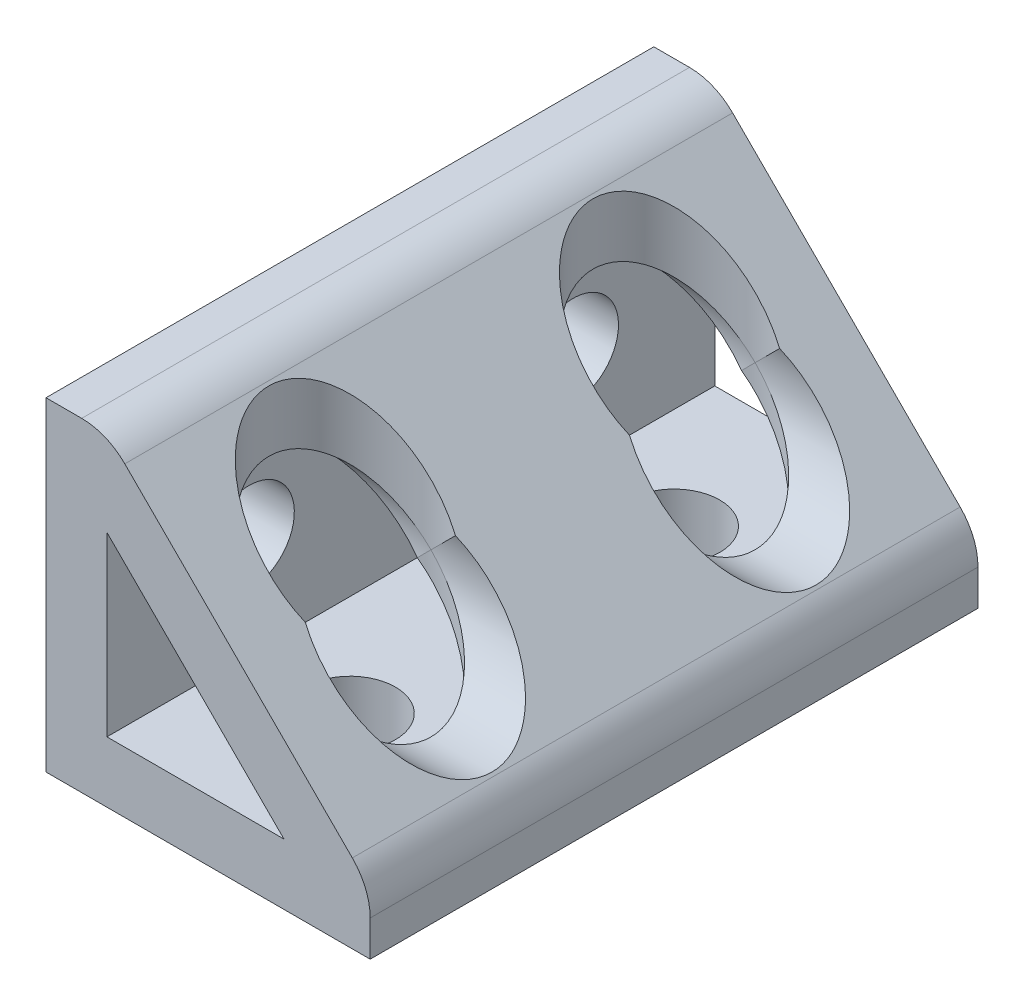
ISO-10303-21;
HEADER;
FILE_DESCRIPTION(('STEP AP214'),'2;1');
FILE_NAME('part.step','',(''),(''),'','','');
FILE_SCHEMA(('AUTOMOTIVE_DESIGN { 1 0 10303 214 1 1 1 1 }'));
ENDSEC;
DATA;
#1=APPLICATION_CONTEXT('core data for automotive mechanical design processes');
#2=APPLICATION_PROTOCOL_DEFINITION('international standard','automotive_design',2000,#1);
#3=PRODUCT_CONTEXT('',#1,'mechanical');
#4=PRODUCT('Part','Part','',(#3));
#5=PRODUCT_RELATED_PRODUCT_CATEGORY('part','',(#4));
#6=PRODUCT_DEFINITION_FORMATION('','',#4);
#7=PRODUCT_DEFINITION_CONTEXT('part definition',#1,'design');
#8=PRODUCT_DEFINITION('design','',#6,#7);
#9=PRODUCT_DEFINITION_SHAPE('','',#8);
#10=(LENGTH_UNIT() NAMED_UNIT(*) SI_UNIT(.MILLI.,.METRE.));
#11=(NAMED_UNIT(*) PLANE_ANGLE_UNIT() SI_UNIT($,.RADIAN.));
#12=(NAMED_UNIT(*) SI_UNIT($,.STERADIAN.) SOLID_ANGLE_UNIT());
#13=UNCERTAINTY_MEASURE_WITH_UNIT(LENGTH_MEASURE(1.E-05),#10,'distance_accuracy_value','');
#14=(GEOMETRIC_REPRESENTATION_CONTEXT(3) GLOBAL_UNCERTAINTY_ASSIGNED_CONTEXT((#13)) GLOBAL_UNIT_ASSIGNED_CONTEXT((#10,
#11,#12)) REPRESENTATION_CONTEXT('',''));
#15=CARTESIAN_POINT('',(0.,0.,0.));
#16=DIRECTION('',(0.,0.,1.));
#17=DIRECTION('',(1.,0.,0.));
#18=AXIS2_PLACEMENT_3D('',#15,#16,#17);
#19=CARTESIAN_POINT('',(12.7,0.,-12.7));
#20=DIRECTION('',(-1.,0.,0.));
#21=DIRECTION('',(0.,-1.,0.));
#22=AXIS2_PLACEMENT_3D('',#19,#20,#21);
#23=CYLINDRICAL_SURFACE('',#22,6.35);
#24=CARTESIAN_POINT('',(0.,0.,-12.7));
#25=DIRECTION('',(-0.707106781186547,-0.707106781186548,0.));
#26=DIRECTION('',(-0.707106781186548,0.707106781186547,0.));
#27=AXIS2_PLACEMENT_3D('',#24,#25,#26);
#28=ELLIPSE('',#27,8.98025612106916,6.35);
#29=CARTESIAN_POINT('',(0.,0.,-6.35));
#30=VERTEX_POINT('',#29);
#31=CARTESIAN_POINT('',(0.,0.,-19.05));
#32=VERTEX_POINT('',#31);
#33=EDGE_CURVE('E515',#30,#32,#28,.F.);
#34=ORIENTED_EDGE('',*,*,#33,.F.);
#35=CARTESIAN_POINT('',(0.,0.,-12.7));
#36=DIRECTION('',(-0.707106781186548,0.707106781186547,0.));
#37=DIRECTION('',(-0.707106781186547,-0.707106781186548,0.));
#38=AXIS2_PLACEMENT_3D('',#35,#36,#37);
#39=ELLIPSE('',#38,8.98025612106916,6.35);
#40=CARTESIAN_POINT('',(2.3876,2.3876,-6.81596513946424));
#41=VERTEX_POINT('',#40);
#42=EDGE_CURVE('E566',#41,#30,#39,.F.);
#43=ORIENTED_EDGE('',*,*,#42,.F.);
#44=CARTESIAN_POINT('',(4.7752,0.,-12.7));
#45=DIRECTION('',(0.707106781186547,0.707106781186548,0.));
#46=DIRECTION('',(-0.707106781186548,0.707106781186547,0.));
#47=AXIS2_PLACEMENT_3D('',#44,#45,#46);
#48=ELLIPSE('',#47,8.98025612106916,6.35);
#49=CARTESIAN_POINT('',(2.3876,2.3876,-18.5840348605358));
#50=VERTEX_POINT('',#49);
#51=EDGE_CURVE('E428',#50,#41,#48,.F.);
#52=ORIENTED_EDGE('',*,*,#51,.F.);
#53=EDGE_CURVE('E657',#32,#50,#39,.F.);
#54=ORIENTED_EDGE('',*,*,#53,.F.);
#55=EDGE_LOOP('',(#34,#43,#52,#54));
#56=FACE_BOUND('',#55,.T.);
#57=ADVANCED_FACE('F47',(#56),#23,.F.);
#58=CARTESIAN_POINT('',(12.7,0.,12.7));
#59=DIRECTION('',(-1.,0.,0.));
#60=DIRECTION('',(0.,-1.,0.));
#61=AXIS2_PLACEMENT_3D('',#58,#59,#60);
#62=CYLINDRICAL_SURFACE('',#61,6.35);
#63=CARTESIAN_POINT('',(0.,0.,12.7));
#64=DIRECTION('',(-0.707106781186547,-0.707106781186548,0.));
#65=DIRECTION('',(-0.707106781186548,0.707106781186547,0.));
#66=AXIS2_PLACEMENT_3D('',#63,#64,#65);
#67=ELLIPSE('',#66,8.98025612106916,6.35);
#68=CARTESIAN_POINT('',(0.,0.,19.05));
#69=VERTEX_POINT('',#68);
#70=CARTESIAN_POINT('',(0.,0.,6.35));
#71=VERTEX_POINT('',#70);
#72=EDGE_CURVE('E536',#69,#71,#67,.F.);
#73=ORIENTED_EDGE('',*,*,#72,.F.);
#74=CARTESIAN_POINT('',(0.,0.,12.7));
#75=DIRECTION('',(-0.707106781186548,0.707106781186547,0.));
#76=DIRECTION('',(-0.707106781186547,-0.707106781186548,0.));
#77=AXIS2_PLACEMENT_3D('',#74,#75,#76);
#78=ELLIPSE('',#77,8.98025612106916,6.35);
#79=CARTESIAN_POINT('',(2.3876,2.3876,18.5840348605358));
#80=VERTEX_POINT('',#79);
#81=EDGE_CURVE('E529',#80,#69,#78,.F.);
#82=ORIENTED_EDGE('',*,*,#81,.F.);
#83=CARTESIAN_POINT('',(4.7752,0.,12.7));
#84=DIRECTION('',(0.707106781186547,0.707106781186548,0.));
#85=DIRECTION('',(-0.707106781186548,0.707106781186547,0.));
#86=AXIS2_PLACEMENT_3D('',#83,#84,#85);
#87=ELLIPSE('',#86,8.98025612106916,6.35);
#88=CARTESIAN_POINT('',(2.3876,2.3876,6.81596513946424));
#89=VERTEX_POINT('',#88);
#90=EDGE_CURVE('E347',#89,#80,#87,.F.);
#91=ORIENTED_EDGE('',*,*,#90,.F.);
#92=EDGE_CURVE('E532',#71,#89,#78,.F.);
#93=ORIENTED_EDGE('',*,*,#92,.F.);
#94=EDGE_LOOP('',(#73,#82,#91,#93));
#95=FACE_BOUND('',#94,.T.);
#96=ADVANCED_FACE('F495',(#95),#62,.F.);
#97=CARTESIAN_POINT('',(5.94684739695598,-7.9248,-23.8125));
#98=DIRECTION('',(0.707106781186547,0.707106781186548,0.));
#99=DIRECTION('',(-0.707106781186548,0.707106781186547,0.));
#100=AXIS2_PLACEMENT_3D('',#97,#98,#99);
#101=PLANE('',#100);
#102=DIRECTION('',(0.,0.,1.));
#103=VECTOR('',#102,1.);
#104=CARTESIAN_POINT('',(5.94684739695598,-7.9248,-23.8125));
#105=LINE('',#104,#103);
#106=CARTESIAN_POINT('',(5.94684739695598,-7.9248,-10.4734542364196));
#107=VERTEX_POINT('',#106);
#108=CARTESIAN_POINT('',(5.94684739695598,-7.9248,10.4734542364196));
#109=VERTEX_POINT('',#108);
#110=EDGE_CURVE('E259',#107,#109,#105,.T.);
#111=ORIENTED_EDGE('',*,*,#110,.T.);
#112=CARTESIAN_POINT('',(0.,-1.97795260304402,12.7));
#113=DIRECTION('',(0.707106781186547,0.707106781186548,0.));
#114=DIRECTION('',(0.707106781186548,-0.707106781186547,0.));
#115=AXIS2_PLACEMENT_3D('',#112,#113,#114);
#116=ELLIPSE('',#115,8.98025612106916,6.35);
#117=CARTESIAN_POINT('',(-0.988976301522011,-0.988976301522013,6.42748647868912));
#118=VERTEX_POINT('',#117);
#119=EDGE_CURVE('E233',#109,#118,#116,.T.);
#120=ORIENTED_EDGE('',*,*,#119,.T.);
#121=CARTESIAN_POINT('',(-1.97795260304402,0.,12.7));
#122=DIRECTION('',(0.707106781186547,0.707106781186548,0.));
#123=DIRECTION('',(-0.707106781186548,0.707106781186547,0.));
#124=AXIS2_PLACEMENT_3D('',#121,#122,#123);
#125=ELLIPSE('',#124,8.98025612106916,6.35);
#126=CARTESIAN_POINT('',(-7.9248,5.94684739695598,10.4734542364196));
#127=VERTEX_POINT('',#126);
#128=EDGE_CURVE('E439',#127,#118,#125,.F.);
#129=ORIENTED_EDGE('',*,*,#128,.F.);
#130=DIRECTION('',(0.,0.,1.));
#131=VECTOR('',#130,1.);
#132=CARTESIAN_POINT('',(-7.9248,5.94684739695598,-23.8125));
#133=LINE('',#132,#131);
#134=CARTESIAN_POINT('',(-7.9248,5.94684739695598,-10.4734542364196));
#135=VERTEX_POINT('',#134);
#136=EDGE_CURVE('E403',#135,#127,#133,.T.);
#137=ORIENTED_EDGE('',*,*,#136,.F.);
#138=CARTESIAN_POINT('',(-1.97795260304402,0.,-12.7));
#139=DIRECTION('',(0.707106781186547,0.707106781186548,0.));
#140=DIRECTION('',(-0.707106781186548,0.707106781186547,0.));
#141=AXIS2_PLACEMENT_3D('',#138,#139,#140);
#142=ELLIPSE('',#141,8.98025612106916,6.35);
#143=CARTESIAN_POINT('',(-0.988976301522011,-0.988976301522013,-6.42748647868912));
#144=VERTEX_POINT('',#143);
#145=EDGE_CURVE('E429',#144,#135,#142,.F.);
#146=ORIENTED_EDGE('',*,*,#145,.F.);
#147=CARTESIAN_POINT('',(0.,-1.97795260304402,-12.7));
#148=DIRECTION('',(0.707106781186547,0.707106781186548,0.));
#149=DIRECTION('',(0.707106781186548,-0.707106781186547,0.));
#150=AXIS2_PLACEMENT_3D('',#147,#148,#149);
#151=ELLIPSE('',#150,8.98025612106916,6.35);
#152=EDGE_CURVE('E523',#144,#107,#151,.T.);
#153=ORIENTED_EDGE('',*,*,#152,.T.);
#154=EDGE_LOOP('',(#111,#120,#129,#137,#146,#153));
#155=FACE_BOUND('',#154,.T.);
#156=ADVANCED_FACE('F493',(#155),#101,.F.);
#157=CARTESIAN_POINT('',(5.94684739695598,-7.9248,-23.8125));
#158=VERTEX_POINT('',#157);
#159=CARTESIAN_POINT('',(5.94684739695598,-7.9248,-14.9265457635804));
#160=VERTEX_POINT('',#159);
#161=EDGE_CURVE('E262',#158,#160,#105,.T.);
#162=ORIENTED_EDGE('',*,*,#161,.T.);
#163=CARTESIAN_POINT('',(-0.988976301522011,-0.988976301522013,-18.9725135213109));
#164=VERTEX_POINT('',#163);
#165=EDGE_CURVE('E425',#160,#164,#151,.T.);
#166=ORIENTED_EDGE('',*,*,#165,.T.);
#167=CARTESIAN_POINT('',(-7.9248,5.94684739695598,-14.9265457635804));
#168=VERTEX_POINT('',#167);
#169=EDGE_CURVE('E423',#168,#164,#142,.F.);
#170=ORIENTED_EDGE('',*,*,#169,.F.);
#171=CARTESIAN_POINT('',(-7.9248,5.94684739695598,-23.8125));
#172=VERTEX_POINT('',#171);
#173=EDGE_CURVE('E267',#172,#168,#133,.T.);
#174=ORIENTED_EDGE('',*,*,#173,.F.);
#175=DIRECTION('',(-0.707106781186548,0.707106781186547,0.));
#176=VECTOR('',#175,1.);
#177=CARTESIAN_POINT('',(5.94684739695598,-7.9248,-23.8125));
#178=LINE('',#177,#176);
#179=EDGE_CURVE('E388',#158,#172,#178,.T.);
#180=ORIENTED_EDGE('',*,*,#179,.F.);
#181=EDGE_LOOP('',(#162,#166,#170,#174,#180));
#182=FACE_BOUND('',#181,.T.);
#183=ADVANCED_FACE('F421',(#182),#101,.F.);
#184=CARTESIAN_POINT('',(0.,0.,-12.7));
#185=DIRECTION('',(-0.707106781186547,-0.707106781186548,0.));
#186=DIRECTION('',(-0.707106781186548,0.707106781186547,0.));
#187=AXIS2_PLACEMENT_3D('',#184,#185,#186);
#188=ELLIPSE('',#187,8.98025612106916,6.35);
#189=EDGE_CURVE('E79',#30,#32,#188,.T.);
#190=ORIENTED_EDGE('',*,*,#189,.F.);
#191=CARTESIAN_POINT('',(0.,0.,-12.7));
#192=DIRECTION('',(-0.707106781186548,0.707106781186547,0.));
#193=DIRECTION('',(-0.707106781186547,-0.707106781186548,0.));
#194=AXIS2_PLACEMENT_3D('',#191,#192,#193);
#195=ELLIPSE('',#194,8.98025612106916,6.35);
#196=EDGE_CURVE('E512',#144,#30,#195,.T.);
#197=ORIENTED_EDGE('',*,*,#196,.F.);
#198=ORIENTED_EDGE('',*,*,#145,.T.);
#199=CARTESIAN_POINT('',(-7.9248,0.,-12.7));
#200=DIRECTION('',(1.,0.,0.));
#201=DIRECTION('',(0.,-1.,0.));
#202=AXIS2_PLACEMENT_3D('',#199,#200,#201);
#203=CIRCLE('',#202,6.35);
#204=EDGE_CURVE('E417',#168,#135,#203,.T.);
#205=ORIENTED_EDGE('',*,*,#204,.F.);
#206=ORIENTED_EDGE('',*,*,#169,.T.);
#207=EDGE_CURVE('E514',#32,#164,#195,.T.);
#208=ORIENTED_EDGE('',*,*,#207,.F.);
#209=EDGE_LOOP('',(#190,#197,#198,#205,#206,#208));
#210=FACE_BOUND('',#209,.T.);
#211=ADVANCED_FACE('F498',(#210),#23,.F.);
#212=CARTESIAN_POINT('',(0.,0.,12.7));
#213=DIRECTION('',(-0.707106781186547,-0.707106781186548,0.));
#214=DIRECTION('',(-0.707106781186548,0.707106781186547,0.));
#215=AXIS2_PLACEMENT_3D('',#212,#213,#214);
#216=ELLIPSE('',#215,8.98025612106916,6.35);
#217=EDGE_CURVE('E68',#69,#71,#216,.T.);
#218=ORIENTED_EDGE('',*,*,#217,.F.);
#219=CARTESIAN_POINT('',(0.,0.,12.7));
#220=DIRECTION('',(-0.707106781186548,0.707106781186547,0.));
#221=DIRECTION('',(-0.707106781186547,-0.707106781186548,0.));
#222=AXIS2_PLACEMENT_3D('',#219,#220,#221);
#223=ELLIPSE('',#222,8.98025612106916,6.35);
#224=CARTESIAN_POINT('',(-0.988976301522011,-0.988976301522013,18.9725135213109));
#225=VERTEX_POINT('',#224);
#226=EDGE_CURVE('E451',#225,#69,#223,.T.);
#227=ORIENTED_EDGE('',*,*,#226,.F.);
#228=CARTESIAN_POINT('',(-7.9248,5.94684739695598,14.9265457635804));
#229=VERTEX_POINT('',#228);
#230=EDGE_CURVE('E249',#225,#229,#125,.F.);
#231=ORIENTED_EDGE('',*,*,#230,.T.);
#232=CARTESIAN_POINT('',(-7.9248,0.,12.7));
#233=DIRECTION('',(1.,0.,0.));
#234=DIRECTION('',(0.,1.,0.));
#235=AXIS2_PLACEMENT_3D('',#232,#233,#234);
#236=CIRCLE('',#235,6.35);
#237=EDGE_CURVE('E436',#127,#229,#236,.T.);
#238=ORIENTED_EDGE('',*,*,#237,.F.);
#239=ORIENTED_EDGE('',*,*,#128,.T.);
#240=EDGE_CURVE('E251',#71,#118,#223,.T.);
#241=ORIENTED_EDGE('',*,*,#240,.F.);
#242=EDGE_LOOP('',(#218,#227,#231,#238,#239,#241));
#243=FACE_BOUND('',#242,.T.);
#244=ADVANCED_FACE('F450',(#243),#62,.F.);
#245=ORIENTED_EDGE('',*,*,#230,.F.);
#246=CARTESIAN_POINT('',(5.94684739695598,-7.9248,14.9265457635804));
#247=VERTEX_POINT('',#246);
#248=EDGE_CURVE('E230',#225,#247,#116,.T.);
#249=ORIENTED_EDGE('',*,*,#248,.T.);
#250=CARTESIAN_POINT('',(5.94684739695598,-7.9248,23.8125));
#251=VERTEX_POINT('',#250);
#252=EDGE_CURVE('E246',#247,#251,#105,.T.);
#253=ORIENTED_EDGE('',*,*,#252,.T.);
#254=DIRECTION('',(-0.707106781186548,0.707106781186547,0.));
#255=VECTOR('',#254,1.);
#256=CARTESIAN_POINT('',(5.94684739695598,-7.9248,23.8125));
#257=LINE('',#256,#255);
#258=CARTESIAN_POINT('',(-7.9248,5.94684739695598,23.8125));
#259=VERTEX_POINT('',#258);
#260=EDGE_CURVE('E336',#251,#259,#257,.T.);
#261=ORIENTED_EDGE('',*,*,#260,.T.);
#262=EDGE_CURVE('E398',#229,#259,#133,.T.);
#263=ORIENTED_EDGE('',*,*,#262,.F.);
#264=EDGE_LOOP('',(#245,#249,#253,#261,#263));
#265=FACE_BOUND('',#264,.T.);
#266=ADVANCED_FACE('F244',(#265),#101,.F.);
#267=CARTESIAN_POINT('',(-9.902752603044,12.7,-23.8125));
#268=DIRECTION('',(0.,1.,0.));
#269=DIRECTION('',(0.,0.,1.));
#270=AXIS2_PLACEMENT_3D('',#267,#268,#269);
#271=PLANE('',#270);
#272=DIRECTION('',(0.,0.,1.));
#273=VECTOR('',#272,1.);
#274=CARTESIAN_POINT('',(-12.7,12.7,-23.8125));
#275=LINE('',#274,#273);
#276=CARTESIAN_POINT('',(-12.7,12.7,-23.8125));
#277=VERTEX_POINT('',#276);
#278=CARTESIAN_POINT('',(-12.7,12.7,23.8125));
#279=VERTEX_POINT('',#278);
#280=EDGE_CURVE('E310',#277,#279,#275,.T.);
#281=ORIENTED_EDGE('',*,*,#280,.T.);
#282=DIRECTION('',(-1.,0.,0.));
#283=VECTOR('',#282,1.);
#284=CARTESIAN_POINT('',(-9.902752603044,12.7,23.8125));
#285=LINE('',#284,#283);
#286=CARTESIAN_POINT('',(-9.902752603044,12.7,23.8125));
#287=VERTEX_POINT('',#286);
#288=EDGE_CURVE('E360',#287,#279,#285,.T.);
#289=ORIENTED_EDGE('',*,*,#288,.F.);
#290=DIRECTION('',(0.,0.,1.));
#291=VECTOR('',#290,1.);
#292=CARTESIAN_POINT('',(-9.902752603044,12.7,-23.8125));
#293=LINE('',#292,#291);
#294=CARTESIAN_POINT('',(-9.902752603044,12.7,-23.8125));
#295=VERTEX_POINT('',#294);
#296=EDGE_CURVE('E11',#295,#287,#293,.T.);
#297=ORIENTED_EDGE('',*,*,#296,.F.);
#298=DIRECTION('',(-1.,0.,0.));
#299=VECTOR('',#298,1.);
#300=CARTESIAN_POINT('',(-9.902752603044,12.7,-23.8125));
#301=LINE('',#300,#299);
#302=EDGE_CURVE('E272',#295,#277,#301,.T.);
#303=ORIENTED_EDGE('',*,*,#302,.T.);
#304=EDGE_LOOP('',(#281,#289,#297,#303));
#305=FACE_BOUND('',#304,.T.);
#306=ADVANCED_FACE('F49',(#305),#271,.T.);
#307=CARTESIAN_POINT('',(-9.902752603044,7.9248,-23.8125));
#308=DIRECTION('',(0.,0.,1.));
#309=DIRECTION('',(1.,0.,0.));
#310=AXIS2_PLACEMENT_3D('',#307,#308,#309);
#311=CYLINDRICAL_SURFACE('',#310,4.7752);
#312=ORIENTED_EDGE('',*,*,#296,.T.);
#313=CARTESIAN_POINT('',(-9.902752603044,7.9248,23.8125));
#314=DIRECTION('',(0.,0.,1.));
#315=DIRECTION('',(1.,0.,0.));
#316=AXIS2_PLACEMENT_3D('',#313,#314,#315);
#317=CIRCLE('',#316,4.7752);
#318=CARTESIAN_POINT('',(-6.526176301522,11.301376301522,23.8125));
#319=VERTEX_POINT('',#318);
#320=EDGE_CURVE('E384',#319,#287,#317,.T.);
#321=ORIENTED_EDGE('',*,*,#320,.F.);
#322=DIRECTION('',(0.,0.,1.));
#323=VECTOR('',#322,1.);
#324=CARTESIAN_POINT('',(-6.526176301522,11.301376301522,-23.8125));
#325=LINE('',#324,#323);
#326=CARTESIAN_POINT('',(-6.526176301522,11.301376301522,-23.8125));
#327=VERTEX_POINT('',#326);
#328=EDGE_CURVE('E57',#327,#319,#325,.T.);
#329=ORIENTED_EDGE('',*,*,#328,.F.);
#330=CARTESIAN_POINT('',(-9.902752603044,7.9248,-23.8125));
#331=DIRECTION('',(0.,0.,1.));
#332=DIRECTION('',(1.,0.,0.));
#333=AXIS2_PLACEMENT_3D('',#330,#331,#332);
#334=CIRCLE('',#333,4.7752);
#335=EDGE_CURVE('E308',#327,#295,#334,.T.);
#336=ORIENTED_EDGE('',*,*,#335,.T.);
#337=EDGE_LOOP('',(#312,#321,#329,#336));
#338=FACE_BOUND('',#337,.T.);
#339=ADVANCED_FACE('F466',(#338),#311,.T.);
#340=CARTESIAN_POINT('',(11.301376301522,-6.526176301522,-23.8125));
#341=DIRECTION('',(0.707106781186547,0.707106781186548,0.));
#342=DIRECTION('',(-0.707106781186548,0.707106781186547,0.));
#343=AXIS2_PLACEMENT_3D('',#340,#341,#342);
#344=PLANE('',#343);
#345=CARTESIAN_POINT('',(0.,4.7752,12.7));
#346=DIRECTION('',(0.707106781186547,0.707106781186548,0.));
#347=DIRECTION('',(0.707106781186548,-0.707106781186547,0.));
#348=AXIS2_PLACEMENT_3D('',#345,#346,#347);
#349=ELLIPSE('',#348,8.98025612106916,6.35);
#350=EDGE_CURVE('E520',#89,#80,#349,.T.);
#351=ORIENTED_EDGE('',*,*,#350,.F.);
#352=ORIENTED_EDGE('',*,*,#90,.T.);
#353=EDGE_LOOP('',(#351,#352));
#354=FACE_BOUND('',#353,.T.);
#355=CARTESIAN_POINT('',(0.,4.7752,-12.7));
#356=DIRECTION('',(0.707106781186547,0.707106781186548,0.));
#357=DIRECTION('',(0.707106781186548,-0.707106781186547,0.));
#358=AXIS2_PLACEMENT_3D('',#355,#356,#357);
#359=ELLIPSE('',#358,8.98025612106916,6.35);
#360=EDGE_CURVE('E239',#50,#41,#359,.T.);
#361=ORIENTED_EDGE('',*,*,#360,.F.);
#362=ORIENTED_EDGE('',*,*,#51,.T.);
#363=EDGE_LOOP('',(#361,#362));
#364=FACE_BOUND('',#363,.T.);
#365=ORIENTED_EDGE('',*,*,#328,.T.);
#366=DIRECTION('',(-0.707106781186548,0.707106781186547,0.));
#367=VECTOR('',#366,1.);
#368=CARTESIAN_POINT('',(11.301376301522,-6.526176301522,23.8125));
#369=LINE('',#368,#367);
#370=CARTESIAN_POINT('',(11.301376301522,-6.526176301522,23.8125));
#371=VERTEX_POINT('',#370);
#372=EDGE_CURVE('E380',#371,#319,#369,.T.);
#373=ORIENTED_EDGE('',*,*,#372,.F.);
#374=DIRECTION('',(0.,0.,1.));
#375=VECTOR('',#374,1.);
#376=CARTESIAN_POINT('',(11.301376301522,-6.526176301522,-23.8125));
#377=LINE('',#376,#375);
#378=CARTESIAN_POINT('',(11.301376301522,-6.526176301522,-23.8125));
#379=VERTEX_POINT('',#378);
#380=EDGE_CURVE('E314',#379,#371,#377,.T.);
#381=ORIENTED_EDGE('',*,*,#380,.F.);
#382=DIRECTION('',(-0.707106781186548,0.707106781186547,0.));
#383=VECTOR('',#382,1.);
#384=CARTESIAN_POINT('',(11.301376301522,-6.526176301522,-23.8125));
#385=LINE('',#384,#383);
#386=EDGE_CURVE('E304',#379,#327,#385,.T.);
#387=ORIENTED_EDGE('',*,*,#386,.T.);
#388=EDGE_LOOP('',(#365,#373,#381,#387));
#389=FACE_BOUND('',#388,.T.);
#390=ADVANCED_FACE('F470',(#354,#364,#389),#344,.T.);
#391=CARTESIAN_POINT('',(7.9248,-9.902752603044,-23.8125));
#392=DIRECTION('',(0.,0.,1.));
#393=DIRECTION('',(1.,0.,0.));
#394=AXIS2_PLACEMENT_3D('',#391,#392,#393);
#395=CYLINDRICAL_SURFACE('',#394,4.7752);
#396=ORIENTED_EDGE('',*,*,#380,.T.);
#397=CARTESIAN_POINT('',(7.9248,-9.902752603044,23.8125));
#398=DIRECTION('',(0.,0.,1.));
#399=DIRECTION('',(1.,0.,0.));
#400=AXIS2_PLACEMENT_3D('',#397,#398,#399);
#401=CIRCLE('',#400,4.7752);
#402=CARTESIAN_POINT('',(12.7,-9.902752603044,23.8125));
#403=VERTEX_POINT('',#402);
#404=EDGE_CURVE('E376',#403,#371,#401,.T.);
#405=ORIENTED_EDGE('',*,*,#404,.F.);
#406=DIRECTION('',(0.,0.,1.));
#407=VECTOR('',#406,1.);
#408=CARTESIAN_POINT('',(12.7,-9.902752603044,-23.8125));
#409=LINE('',#408,#407);
#410=CARTESIAN_POINT('',(12.7,-9.902752603044,-23.8125));
#411=VERTEX_POINT('',#410);
#412=EDGE_CURVE('E317',#411,#403,#409,.T.);
#413=ORIENTED_EDGE('',*,*,#412,.F.);
#414=CARTESIAN_POINT('',(7.9248,-9.902752603044,-23.8125));
#415=DIRECTION('',(0.,0.,1.));
#416=DIRECTION('',(1.,0.,0.));
#417=AXIS2_PLACEMENT_3D('',#414,#415,#416);
#418=CIRCLE('',#417,4.7752);
#419=EDGE_CURVE('E300',#411,#379,#418,.T.);
#420=ORIENTED_EDGE('',*,*,#419,.T.);
#421=EDGE_LOOP('',(#396,#405,#413,#420));
#422=FACE_BOUND('',#421,.T.);
#423=ADVANCED_FACE('F474',(#422),#395,.T.);
#424=CARTESIAN_POINT('',(12.7,-12.7,-23.8125));
#425=DIRECTION('',(1.,0.,0.));
#426=DIRECTION('',(0.,0.,-1.));
#427=AXIS2_PLACEMENT_3D('',#424,#425,#426);
#428=PLANE('',#427);
#429=ORIENTED_EDGE('',*,*,#412,.T.);
#430=DIRECTION('',(0.,1.,0.));
#431=VECTOR('',#430,1.);
#432=CARTESIAN_POINT('',(12.7,-12.7,23.8125));
#433=LINE('',#432,#431);
#434=CARTESIAN_POINT('',(12.7,-12.7,23.8125));
#435=VERTEX_POINT('',#434);
#436=EDGE_CURVE('E372',#435,#403,#433,.T.);
#437=ORIENTED_EDGE('',*,*,#436,.F.);
#438=DIRECTION('',(0.,0.,1.));
#439=VECTOR('',#438,1.);
#440=CARTESIAN_POINT('',(12.7,-12.7,-23.8125));
#441=LINE('',#440,#439);
#442=CARTESIAN_POINT('',(12.7,-12.7,-23.8125));
#443=VERTEX_POINT('',#442);
#444=EDGE_CURVE('E319',#443,#435,#441,.T.);
#445=ORIENTED_EDGE('',*,*,#444,.F.);
#446=DIRECTION('',(0.,1.,0.));
#447=VECTOR('',#446,1.);
#448=CARTESIAN_POINT('',(12.7,-12.7,-23.8125));
#449=LINE('',#448,#447);
#450=EDGE_CURVE('E297',#443,#411,#449,.T.);
#451=ORIENTED_EDGE('',*,*,#450,.T.);
#452=EDGE_LOOP('',(#429,#437,#445,#451));
#453=FACE_BOUND('',#452,.T.);
#454=ADVANCED_FACE('F478',(#453),#428,.T.);
#455=CARTESIAN_POINT('',(-12.7,-12.7,-23.8125));
#456=DIRECTION('',(0.,-1.,0.));
#457=DIRECTION('',(1.,0.,0.));
#458=AXIS2_PLACEMENT_3D('',#455,#456,#457);
#459=PLANE('',#458);
#460=CARTESIAN_POINT('',(0.,-12.7,12.7));
#461=DIRECTION('',(0.,1.,0.));
#462=DIRECTION('',(-1.,0.,0.));
#463=AXIS2_PLACEMENT_3D('',#460,#461,#462);
#464=CIRCLE('',#463,3.5687);
#465=CARTESIAN_POINT('',(-3.5687,-12.7,12.7));
#466=VERTEX_POINT('',#465);
#467=EDGE_CURVE('E540',#466,#466,#464,.T.);
#468=ORIENTED_EDGE('',*,*,#467,.T.);
#469=EDGE_LOOP('',(#468));
#470=FACE_BOUND('',#469,.T.);
#471=CARTESIAN_POINT('',(0.,-12.7,-12.7));
#472=DIRECTION('',(0.,1.,0.));
#473=DIRECTION('',(1.,0.,0.));
#474=AXIS2_PLACEMENT_3D('',#471,#472,#473);
#475=CIRCLE('',#474,3.5687);
#476=CARTESIAN_POINT('',(3.5687,-12.7,-12.7));
#477=VERTEX_POINT('',#476);
#478=EDGE_CURVE('E539',#477,#477,#475,.T.);
#479=ORIENTED_EDGE('',*,*,#478,.T.);
#480=EDGE_LOOP('',(#479));
#481=FACE_BOUND('',#480,.T.);
#482=ORIENTED_EDGE('',*,*,#444,.T.);
#483=DIRECTION('',(1.,0.,0.));
#484=VECTOR('',#483,1.);
#485=CARTESIAN_POINT('',(-12.7,-12.7,23.8125));
#486=LINE('',#485,#484);
#487=CARTESIAN_POINT('',(-12.7,-12.7,23.8125));
#488=VERTEX_POINT('',#487);
#489=EDGE_CURVE('E368',#488,#435,#486,.T.);
#490=ORIENTED_EDGE('',*,*,#489,.F.);
#491=DIRECTION('',(0.,0.,1.));
#492=VECTOR('',#491,1.);
#493=CARTESIAN_POINT('',(-12.7,-12.7,-23.8125));
#494=LINE('',#493,#492);
#495=CARTESIAN_POINT('',(-12.7,-12.7,-23.8125));
#496=VERTEX_POINT('',#495);
#497=EDGE_CURVE('E322',#496,#488,#494,.T.);
#498=ORIENTED_EDGE('',*,*,#497,.F.);
#499=DIRECTION('',(1.,0.,0.));
#500=VECTOR('',#499,1.);
#501=CARTESIAN_POINT('',(-12.7,-12.7,-23.8125));
#502=LINE('',#501,#500);
#503=EDGE_CURVE('E290',#496,#443,#502,.T.);
#504=ORIENTED_EDGE('',*,*,#503,.T.);
#505=EDGE_LOOP('',(#482,#490,#498,#504));
#506=FACE_BOUND('',#505,.T.);
#507=ADVANCED_FACE('F483',(#470,#481,#506),#459,.T.);
#508=CARTESIAN_POINT('',(-12.7,12.7,-23.8125));
#509=DIRECTION('',(-1.,0.,0.));
#510=DIRECTION('',(0.,-1.,0.));
#511=AXIS2_PLACEMENT_3D('',#508,#509,#510);
#512=PLANE('',#511);
#513=CARTESIAN_POINT('',(-12.7,0.,12.7));
#514=DIRECTION('',(-1.,0.,0.));
#515=DIRECTION('',(0.,-1.,0.));
#516=AXIS2_PLACEMENT_3D('',#513,#514,#515);
#517=CIRCLE('',#516,3.5687);
#518=CARTESIAN_POINT('',(-12.7,-3.5687,12.7));
#519=VERTEX_POINT('',#518);
#520=EDGE_CURVE('E328',#519,#519,#517,.T.);
#521=ORIENTED_EDGE('',*,*,#520,.F.);
#522=EDGE_LOOP('',(#521));
#523=FACE_BOUND('',#522,.T.);
#524=CARTESIAN_POINT('',(-12.7,0.,-12.7));
#525=DIRECTION('',(-1.,0.,0.));
#526=DIRECTION('',(0.,1.,0.));
#527=AXIS2_PLACEMENT_3D('',#524,#525,#526);
#528=CIRCLE('',#527,3.5687);
#529=CARTESIAN_POINT('',(-12.7,-3.5687,-12.7));
#530=VERTEX_POINT('',#529);
#531=EDGE_CURVE('E339',#530,#530,#528,.T.);
#532=ORIENTED_EDGE('',*,*,#531,.F.);
#533=EDGE_LOOP('',(#532));
#534=FACE_BOUND('',#533,.T.);
#535=ORIENTED_EDGE('',*,*,#497,.T.);
#536=DIRECTION('',(0.,-1.,0.));
#537=VECTOR('',#536,1.);
#538=CARTESIAN_POINT('',(-12.7,12.7,23.8125));
#539=LINE('',#538,#537);
#540=EDGE_CURVE('E364',#279,#488,#539,.T.);
#541=ORIENTED_EDGE('',*,*,#540,.F.);
#542=ORIENTED_EDGE('',*,*,#280,.F.);
#543=DIRECTION('',(0.,-1.,0.));
#544=VECTOR('',#543,1.);
#545=CARTESIAN_POINT('',(-12.7,12.7,-23.8125));
#546=LINE('',#545,#544);
#547=EDGE_CURVE('E281',#277,#496,#546,.T.);
#548=ORIENTED_EDGE('',*,*,#547,.T.);
#549=EDGE_LOOP('',(#535,#541,#542,#548));
#550=FACE_BOUND('',#549,.T.);
#551=ADVANCED_FACE('F459',(#523,#534,#550),#512,.T.);
#552=CARTESIAN_POINT('',(7.9248,-9.902752603044,-23.8125));
#553=DIRECTION('',(0.,0.,1.));
#554=DIRECTION('',(1.,0.,0.));
#555=AXIS2_PLACEMENT_3D('',#552,#553,#554);
#556=PLANE('',#555);
#557=DIRECTION('',(1.,0.,0.));
#558=VECTOR('',#557,1.);
#559=CARTESIAN_POINT('',(-7.9248,-7.9248,-23.8125));
#560=LINE('',#559,#558);
#561=CARTESIAN_POINT('',(-7.9248,-7.9248,-23.8125));
#562=VERTEX_POINT('',#561);
#563=EDGE_CURVE('E395',#562,#158,#560,.T.);
#564=ORIENTED_EDGE('',*,*,#563,.T.);
#565=ORIENTED_EDGE('',*,*,#179,.T.);
#566=DIRECTION('',(0.,-1.,0.));
#567=VECTOR('',#566,1.);
#568=CARTESIAN_POINT('',(-7.9248,5.94684739695598,-23.8125));
#569=LINE('',#568,#567);
#570=EDGE_CURVE('E392',#172,#562,#569,.T.);
#571=ORIENTED_EDGE('',*,*,#570,.T.);
#572=EDGE_LOOP('',(#564,#565,#571));
#573=FACE_BOUND('',#572,.T.);
#574=ORIENTED_EDGE('',*,*,#302,.F.);
#575=ORIENTED_EDGE('',*,*,#335,.F.);
#576=ORIENTED_EDGE('',*,*,#386,.F.);
#577=ORIENTED_EDGE('',*,*,#419,.F.);
#578=ORIENTED_EDGE('',*,*,#450,.F.);
#579=ORIENTED_EDGE('',*,*,#503,.F.);
#580=ORIENTED_EDGE('',*,*,#547,.F.);
#581=EDGE_LOOP('',(#574,#575,#576,#577,#578,#579,#580));
#582=FACE_BOUND('',#581,.T.);
#583=ADVANCED_FACE('F456',(#573,#582),#556,.F.);
#584=CARTESIAN_POINT('',(-7.9248,-7.9248,-23.8125));
#585=DIRECTION('',(0.,-1.,0.));
#586=DIRECTION('',(0.,0.,-1.));
#587=AXIS2_PLACEMENT_3D('',#584,#585,#586);
#588=PLANE('',#587);
#589=ORIENTED_EDGE('',*,*,#252,.F.);
#590=CARTESIAN_POINT('',(0.,-7.9248,12.7));
#591=DIRECTION('',(0.,-1.,0.));
#592=DIRECTION('',(1.,0.,0.));
#593=AXIS2_PLACEMENT_3D('',#590,#591,#592);
#594=CIRCLE('',#593,6.35);
#595=EDGE_CURVE('E227',#109,#247,#594,.T.);
#596=ORIENTED_EDGE('',*,*,#595,.F.);
#597=ORIENTED_EDGE('',*,*,#110,.F.);
#598=CARTESIAN_POINT('',(0.,-7.9248,-12.7));
#599=DIRECTION('',(0.,-1.,0.));
#600=DIRECTION('',(-1.,0.,0.));
#601=AXIS2_PLACEMENT_3D('',#598,#599,#600);
#602=CIRCLE('',#601,6.35);
#603=EDGE_CURVE('E240',#160,#107,#602,.T.);
#604=ORIENTED_EDGE('',*,*,#603,.F.);
#605=ORIENTED_EDGE('',*,*,#161,.F.);
#606=ORIENTED_EDGE('',*,*,#563,.F.);
#607=DIRECTION('',(0.,0.,1.));
#608=VECTOR('',#607,1.);
#609=CARTESIAN_POINT('',(-7.9248,-7.9248,-23.8125));
#610=LINE('',#609,#608);
#611=CARTESIAN_POINT('',(-7.9248,-7.9248,23.8125));
#612=VERTEX_POINT('',#611);
#613=EDGE_CURVE('E260',#562,#612,#610,.T.);
#614=ORIENTED_EDGE('',*,*,#613,.T.);
#615=DIRECTION('',(1.,0.,0.));
#616=VECTOR('',#615,1.);
#617=CARTESIAN_POINT('',(-7.9248,-7.9248,23.8125));
#618=LINE('',#617,#616);
#619=EDGE_CURVE('E256',#612,#251,#618,.T.);
#620=ORIENTED_EDGE('',*,*,#619,.T.);
#621=EDGE_LOOP('',(#589,#596,#597,#604,#605,#606,#614,#620));
#622=FACE_BOUND('',#621,.T.);
#623=CARTESIAN_POINT('',(0.,-7.9248,-12.7));
#624=DIRECTION('',(0.,-1.,0.));
#625=DIRECTION('',(0.,0.,-1.));
#626=AXIS2_PLACEMENT_3D('',#623,#624,#625);
#627=CIRCLE('',#626,3.5687);
#628=CARTESIAN_POINT('',(0.,-7.9248,-16.2687));
#629=VERTEX_POINT('',#628);
#630=EDGE_CURVE('E550',#629,#629,#627,.F.);
#631=ORIENTED_EDGE('',*,*,#630,.F.);
#632=EDGE_LOOP('',(#631));
#633=FACE_BOUND('',#632,.T.);
#634=CARTESIAN_POINT('',(0.,-7.9248,12.7));
#635=DIRECTION('',(0.,-1.,0.));
#636=DIRECTION('',(0.,0.,-1.));
#637=AXIS2_PLACEMENT_3D('',#634,#635,#636);
#638=CIRCLE('',#637,3.5687);
#639=CARTESIAN_POINT('',(0.,-7.9248,9.1313));
#640=VERTEX_POINT('',#639);
#641=EDGE_CURVE('E544',#640,#640,#638,.F.);
#642=ORIENTED_EDGE('',*,*,#641,.F.);
#643=EDGE_LOOP('',(#642));
#644=FACE_BOUND('',#643,.T.);
#645=ADVANCED_FACE('F253',(#622,#633,#644),#588,.F.);
#646=CARTESIAN_POINT('',(-7.9248,5.94684739695598,-23.8125));
#647=DIRECTION('',(-1.,0.,0.));
#648=DIRECTION('',(0.,-1.,0.));
#649=AXIS2_PLACEMENT_3D('',#646,#647,#648);
#650=PLANE('',#649);
#651=ORIENTED_EDGE('',*,*,#136,.T.);
#652=ORIENTED_EDGE('',*,*,#237,.T.);
#653=ORIENTED_EDGE('',*,*,#262,.T.);
#654=DIRECTION('',(0.,-1.,0.));
#655=VECTOR('',#654,1.);
#656=CARTESIAN_POINT('',(-7.9248,5.94684739695598,23.8125));
#657=LINE('',#656,#655);
#658=EDGE_CURVE('E354',#259,#612,#657,.T.);
#659=ORIENTED_EDGE('',*,*,#658,.T.);
#660=ORIENTED_EDGE('',*,*,#613,.F.);
#661=ORIENTED_EDGE('',*,*,#570,.F.);
#662=ORIENTED_EDGE('',*,*,#173,.T.);
#663=ORIENTED_EDGE('',*,*,#204,.T.);
#664=EDGE_LOOP('',(#651,#652,#653,#659,#660,#661,#662,#663));
#665=FACE_BOUND('',#664,.T.);
#666=CARTESIAN_POINT('',(-7.9248,0.,-12.7));
#667=DIRECTION('',(-1.,0.,0.));
#668=DIRECTION('',(0.,-1.,0.));
#669=AXIS2_PLACEMENT_3D('',#666,#667,#668);
#670=CIRCLE('',#669,3.5687);
#671=CARTESIAN_POINT('',(-7.9248,-3.5687,-12.7));
#672=VERTEX_POINT('',#671);
#673=EDGE_CURVE('E325',#672,#672,#670,.T.);
#674=ORIENTED_EDGE('',*,*,#673,.T.);
#675=EDGE_LOOP('',(#674));
#676=FACE_BOUND('',#675,.T.);
#677=CARTESIAN_POINT('',(-7.9248,0.,12.7));
#678=DIRECTION('',(-1.,0.,0.));
#679=DIRECTION('',(0.,-1.,0.));
#680=AXIS2_PLACEMENT_3D('',#677,#678,#679);
#681=CIRCLE('',#680,3.5687);
#682=CARTESIAN_POINT('',(-7.9248,-3.5687,12.7));
#683=VERTEX_POINT('',#682);
#684=EDGE_CURVE('E51',#683,#683,#681,.T.);
#685=ORIENTED_EDGE('',*,*,#684,.T.);
#686=EDGE_LOOP('',(#685));
#687=FACE_BOUND('',#686,.T.);
#688=ADVANCED_FACE('F416',(#665,#676,#687),#650,.F.);
#689=CARTESIAN_POINT('',(7.9248,-9.902752603044,23.8125));
#690=DIRECTION('',(0.,0.,1.));
#691=DIRECTION('',(1.,0.,0.));
#692=AXIS2_PLACEMENT_3D('',#689,#690,#691);
#693=PLANE('',#692);
#694=ORIENTED_EDGE('',*,*,#288,.T.);
#695=ORIENTED_EDGE('',*,*,#540,.T.);
#696=ORIENTED_EDGE('',*,*,#489,.T.);
#697=ORIENTED_EDGE('',*,*,#436,.T.);
#698=ORIENTED_EDGE('',*,*,#404,.T.);
#699=ORIENTED_EDGE('',*,*,#372,.T.);
#700=ORIENTED_EDGE('',*,*,#320,.T.);
#701=EDGE_LOOP('',(#694,#695,#696,#697,#698,#699,#700));
#702=FACE_BOUND('',#701,.T.);
#703=ORIENTED_EDGE('',*,*,#658,.F.);
#704=ORIENTED_EDGE('',*,*,#260,.F.);
#705=ORIENTED_EDGE('',*,*,#619,.F.);
#706=EDGE_LOOP('',(#703,#704,#705));
#707=FACE_BOUND('',#706,.T.);
#708=ADVANCED_FACE('F455',(#702,#707),#693,.T.);
#709=CARTESIAN_POINT('',(12.7,0.,-12.7));
#710=DIRECTION('',(-1.,0.,0.));
#711=DIRECTION('',(0.,-1.,0.));
#712=AXIS2_PLACEMENT_3D('',#709,#710,#711);
#713=CYLINDRICAL_SURFACE('',#712,3.5687);
#714=CARTESIAN_POINT('',(-12.7,-3.5687,-12.7));
#715=CARTESIAN_POINT('',(-12.6502583333333,-3.5687,-12.7));
#716=CARTESIAN_POINT('',(-12.6005166666667,-3.5687,-12.7));
#717=CARTESIAN_POINT('',(-12.5010333333333,-3.5687,-12.7));
#718=CARTESIAN_POINT('',(-12.4512916666667,-3.5687,-12.7));
#719=CARTESIAN_POINT('',(-12.3518083333333,-3.5687,-12.7));
#720=CARTESIAN_POINT('',(-12.3020666666667,-3.5687,-12.7));
#721=CARTESIAN_POINT('',(-12.2025833333333,-3.5687,-12.7));
#722=CARTESIAN_POINT('',(-12.1528416666667,-3.5687,-12.7));
#723=CARTESIAN_POINT('',(-12.0533583333333,-3.5687,-12.7));
#724=CARTESIAN_POINT('',(-12.0036166666667,-3.5687,-12.7));
#725=CARTESIAN_POINT('',(-11.9041333333333,-3.5687,-12.7));
#726=CARTESIAN_POINT('',(-11.8543916666667,-3.5687,-12.7));
#727=CARTESIAN_POINT('',(-11.7549083333333,-3.5687,-12.7));
#728=CARTESIAN_POINT('',(-11.7051666666667,-3.5687,-12.7));
#729=CARTESIAN_POINT('',(-11.6056833333333,-3.5687,-12.7));
#730=CARTESIAN_POINT('',(-11.5559416666667,-3.5687,-12.7));
#731=CARTESIAN_POINT('',(-11.4564583333333,-3.5687,-12.7));
#732=CARTESIAN_POINT('',(-11.4067166666667,-3.5687,-12.7));
#733=CARTESIAN_POINT('',(-11.3072333333333,-3.5687,-12.7));
#734=CARTESIAN_POINT('',(-11.2574916666667,-3.5687,-12.7));
#735=CARTESIAN_POINT('',(-11.1580083333333,-3.5687,-12.7));
#736=CARTESIAN_POINT('',(-11.1082666666667,-3.5687,-12.7));
#737=CARTESIAN_POINT('',(-11.0087833333333,-3.5687,-12.7));
#738=CARTESIAN_POINT('',(-10.9590416666667,-3.5687,-12.7));
#739=CARTESIAN_POINT('',(-10.8595583333333,-3.5687,-12.7));
#740=CARTESIAN_POINT('',(-10.8098166666667,-3.5687,-12.7));
#741=CARTESIAN_POINT('',(-10.7103333333333,-3.5687,-12.7));
#742=CARTESIAN_POINT('',(-10.6605916666667,-3.5687,-12.7));
#743=CARTESIAN_POINT('',(-10.5611083333333,-3.5687,-12.7));
#744=CARTESIAN_POINT('',(-10.5113666666667,-3.5687,-12.7));
#745=CARTESIAN_POINT('',(-10.4118833333333,-3.5687,-12.7));
#746=CARTESIAN_POINT('',(-10.3621416666667,-3.5687,-12.7));
#747=CARTESIAN_POINT('',(-10.2626583333333,-3.5687,-12.7));
#748=CARTESIAN_POINT('',(-10.2129166666667,-3.5687,-12.7));
#749=CARTESIAN_POINT('',(-10.1134333333333,-3.5687,-12.7));
#750=CARTESIAN_POINT('',(-10.0636916666667,-3.5687,-12.7));
#751=CARTESIAN_POINT('',(-9.96420833333334,-3.5687,-12.7));
#752=CARTESIAN_POINT('',(-9.91446666666667,-3.5687,-12.7));
#753=CARTESIAN_POINT('',(-9.81498333333334,-3.5687,-12.7));
#754=CARTESIAN_POINT('',(-9.76524166666667,-3.5687,-12.7));
#755=CARTESIAN_POINT('',(-9.66575833333333,-3.5687,-12.7));
#756=CARTESIAN_POINT('',(-9.61601666666667,-3.5687,-12.7));
#757=CARTESIAN_POINT('',(-9.51653333333333,-3.5687,-12.7));
#758=CARTESIAN_POINT('',(-9.46679166666667,-3.5687,-12.7));
#759=CARTESIAN_POINT('',(-9.36730833333333,-3.5687,-12.7));
#760=CARTESIAN_POINT('',(-9.31756666666667,-3.5687,-12.7));
#761=CARTESIAN_POINT('',(-9.21808333333333,-3.5687,-12.7));
#762=CARTESIAN_POINT('',(-9.16834166666667,-3.5687,-12.7));
#763=CARTESIAN_POINT('',(-9.06885833333334,-3.5687,-12.7));
#764=CARTESIAN_POINT('',(-9.01911666666667,-3.5687,-12.7));
#765=CARTESIAN_POINT('',(-8.91963333333333,-3.5687,-12.7));
#766=CARTESIAN_POINT('',(-8.86989166666667,-3.5687,-12.7));
#767=CARTESIAN_POINT('',(-8.77040833333333,-3.5687,-12.7));
#768=CARTESIAN_POINT('',(-8.72066666666667,-3.5687,-12.7));
#769=CARTESIAN_POINT('',(-8.62118333333333,-3.5687,-12.7));
#770=CARTESIAN_POINT('',(-8.57144166666667,-3.5687,-12.7));
#771=CARTESIAN_POINT('',(-8.47195833333334,-3.5687,-12.7));
#772=CARTESIAN_POINT('',(-8.42221666666667,-3.5687,-12.7));
#773=CARTESIAN_POINT('',(-8.32273333333334,-3.5687,-12.7));
#774=CARTESIAN_POINT('',(-8.27299166666667,-3.5687,-12.7));
#775=CARTESIAN_POINT('',(-8.17350833333333,-3.5687,-12.7));
#776=CARTESIAN_POINT('',(-8.12376666666667,-3.5687,-12.7));
#777=CARTESIAN_POINT('',(-8.02428333333333,-3.5687,-12.7));
#778=CARTESIAN_POINT('',(-7.97454166666667,-3.5687,-12.7));
#779=CARTESIAN_POINT('',(-7.9248,-3.5687,-12.7));
#780=B_SPLINE_CURVE_WITH_KNOTS('',3,(#714,#715,#716,#717,#718,#719,#720,#721,#722,#723,#724,
#725,#726,#727,#728,#729,#730,#731,#732,#733,#734,#735,#736,#737,#738,#739,#740,#741,#742,#743,
#744,#745,#746,#747,#748,#749,#750,#751,#752,#753,#754,#755,#756,#757,#758,#759,#760,#761,#762,
#763,#764,#765,#766,#767,#768,#769,#770,#771,#772,#773,#774,#775,#776,#777,#778,#779),
.UNSPECIFIED.,.F.,.F.,(4,2,2,2,2,2,2,2,2,2,2,2,2,2,2,2,2,2,2,2,2,2,2,2,2,2,2,2,2,2,2,2,4),(0.,
0.149224999999999,0.298449999999999,0.447675000000002,0.596900000000001,0.746125,0.89535,
1.044575,1.1938,1.343025,1.49225,1.641475,1.7907,1.939925,2.08915,2.238375,2.3876,2.536825,
2.68605,2.835275,2.9845,3.133725,3.28295,3.432175,3.5814,3.730625,3.87985,4.029075,4.1783,
4.327525,4.47675,4.625975,4.7752),.UNSPECIFIED.);
#781=EDGE_CURVE('BSEAM706',#530,#672,#780,.T.);
#782=ORIENTED_EDGE('',*,*,#531,.T.);
#783=ORIENTED_EDGE('',*,*,#673,.F.);
#784=ORIENTED_EDGE('',*,*,#781,.T.);
#785=ORIENTED_EDGE('',*,*,#781,.F.);
#786=EDGE_LOOP('',(#782,#784,#783,#785));
#787=FACE_BOUND('',#786,.T.);
#788=ADVANCED_FACE('F706',(#787),#713,.F.);
#789=CARTESIAN_POINT('',(12.7,0.,12.7));
#790=DIRECTION('',(-1.,0.,0.));
#791=DIRECTION('',(0.,-1.,0.));
#792=AXIS2_PLACEMENT_3D('',#789,#790,#791);
#793=CYLINDRICAL_SURFACE('',#792,3.5687);
#794=CARTESIAN_POINT('',(-12.7,-3.5687,12.7));
#795=CARTESIAN_POINT('',(-12.6502583333333,-3.5687,12.7));
#796=CARTESIAN_POINT('',(-12.6005166666667,-3.5687,12.7));
#797=CARTESIAN_POINT('',(-12.5010333333333,-3.5687,12.7));
#798=CARTESIAN_POINT('',(-12.4512916666667,-3.5687,12.7));
#799=CARTESIAN_POINT('',(-12.3518083333333,-3.5687,12.7));
#800=CARTESIAN_POINT('',(-12.3020666666667,-3.5687,12.7));
#801=CARTESIAN_POINT('',(-12.2025833333333,-3.5687,12.7));
#802=CARTESIAN_POINT('',(-12.1528416666667,-3.5687,12.7));
#803=CARTESIAN_POINT('',(-12.0533583333333,-3.5687,12.7));
#804=CARTESIAN_POINT('',(-12.0036166666667,-3.5687,12.7));
#805=CARTESIAN_POINT('',(-11.9041333333333,-3.5687,12.7));
#806=CARTESIAN_POINT('',(-11.8543916666667,-3.5687,12.7));
#807=CARTESIAN_POINT('',(-11.7549083333333,-3.5687,12.7));
#808=CARTESIAN_POINT('',(-11.7051666666667,-3.5687,12.7));
#809=CARTESIAN_POINT('',(-11.6056833333333,-3.5687,12.7));
#810=CARTESIAN_POINT('',(-11.5559416666667,-3.5687,12.7));
#811=CARTESIAN_POINT('',(-11.4564583333333,-3.5687,12.7));
#812=CARTESIAN_POINT('',(-11.4067166666667,-3.5687,12.7));
#813=CARTESIAN_POINT('',(-11.3072333333333,-3.5687,12.7));
#814=CARTESIAN_POINT('',(-11.2574916666667,-3.5687,12.7));
#815=CARTESIAN_POINT('',(-11.1580083333333,-3.5687,12.7));
#816=CARTESIAN_POINT('',(-11.1082666666667,-3.5687,12.7));
#817=CARTESIAN_POINT('',(-11.0087833333333,-3.5687,12.7));
#818=CARTESIAN_POINT('',(-10.9590416666667,-3.5687,12.7));
#819=CARTESIAN_POINT('',(-10.8595583333333,-3.5687,12.7));
#820=CARTESIAN_POINT('',(-10.8098166666667,-3.5687,12.7));
#821=CARTESIAN_POINT('',(-10.7103333333333,-3.5687,12.7));
#822=CARTESIAN_POINT('',(-10.6605916666667,-3.5687,12.7));
#823=CARTESIAN_POINT('',(-10.5611083333333,-3.5687,12.7));
#824=CARTESIAN_POINT('',(-10.5113666666667,-3.5687,12.7));
#825=CARTESIAN_POINT('',(-10.4118833333333,-3.5687,12.7));
#826=CARTESIAN_POINT('',(-10.3621416666667,-3.5687,12.7));
#827=CARTESIAN_POINT('',(-10.2626583333333,-3.5687,12.7));
#828=CARTESIAN_POINT('',(-10.2129166666667,-3.5687,12.7));
#829=CARTESIAN_POINT('',(-10.1134333333333,-3.5687,12.7));
#830=CARTESIAN_POINT('',(-10.0636916666667,-3.5687,12.7));
#831=CARTESIAN_POINT('',(-9.96420833333334,-3.5687,12.7));
#832=CARTESIAN_POINT('',(-9.91446666666667,-3.5687,12.7));
#833=CARTESIAN_POINT('',(-9.81498333333334,-3.5687,12.7));
#834=CARTESIAN_POINT('',(-9.76524166666667,-3.5687,12.7));
#835=CARTESIAN_POINT('',(-9.66575833333333,-3.5687,12.7));
#836=CARTESIAN_POINT('',(-9.61601666666667,-3.5687,12.7));
#837=CARTESIAN_POINT('',(-9.51653333333333,-3.5687,12.7));
#838=CARTESIAN_POINT('',(-9.46679166666667,-3.5687,12.7));
#839=CARTESIAN_POINT('',(-9.36730833333333,-3.5687,12.7));
#840=CARTESIAN_POINT('',(-9.31756666666667,-3.5687,12.7));
#841=CARTESIAN_POINT('',(-9.21808333333333,-3.5687,12.7));
#842=CARTESIAN_POINT('',(-9.16834166666667,-3.5687,12.7));
#843=CARTESIAN_POINT('',(-9.06885833333334,-3.5687,12.7));
#844=CARTESIAN_POINT('',(-9.01911666666667,-3.5687,12.7));
#845=CARTESIAN_POINT('',(-8.91963333333333,-3.5687,12.7));
#846=CARTESIAN_POINT('',(-8.86989166666667,-3.5687,12.7));
#847=CARTESIAN_POINT('',(-8.77040833333333,-3.5687,12.7));
#848=CARTESIAN_POINT('',(-8.72066666666667,-3.5687,12.7));
#849=CARTESIAN_POINT('',(-8.62118333333333,-3.5687,12.7));
#850=CARTESIAN_POINT('',(-8.57144166666667,-3.5687,12.7));
#851=CARTESIAN_POINT('',(-8.47195833333334,-3.5687,12.7));
#852=CARTESIAN_POINT('',(-8.42221666666667,-3.5687,12.7));
#853=CARTESIAN_POINT('',(-8.32273333333334,-3.5687,12.7));
#854=CARTESIAN_POINT('',(-8.27299166666667,-3.5687,12.7));
#855=CARTESIAN_POINT('',(-8.17350833333333,-3.5687,12.7));
#856=CARTESIAN_POINT('',(-8.12376666666667,-3.5687,12.7));
#857=CARTESIAN_POINT('',(-8.02428333333333,-3.5687,12.7));
#858=CARTESIAN_POINT('',(-7.97454166666667,-3.5687,12.7));
#859=CARTESIAN_POINT('',(-7.9248,-3.5687,12.7));
#860=B_SPLINE_CURVE_WITH_KNOTS('',3,(#794,#795,#796,#797,#798,#799,#800,#801,#802,#803,#804,
#805,#806,#807,#808,#809,#810,#811,#812,#813,#814,#815,#816,#817,#818,#819,#820,#821,#822,#823,
#824,#825,#826,#827,#828,#829,#830,#831,#832,#833,#834,#835,#836,#837,#838,#839,#840,#841,#842,
#843,#844,#845,#846,#847,#848,#849,#850,#851,#852,#853,#854,#855,#856,#857,#858,#859),
.UNSPECIFIED.,.F.,.F.,(4,2,2,2,2,2,2,2,2,2,2,2,2,2,2,2,2,2,2,2,2,2,2,2,2,2,2,2,2,2,2,2,4),(0.,
0.149224999999999,0.298449999999999,0.447675000000002,0.596900000000001,0.746125,0.89535,
1.044575,1.1938,1.343025,1.49225,1.641475,1.7907,1.939925,2.08915,2.238375,2.3876,2.536825,
2.68605,2.835275,2.9845,3.133725,3.28295,3.432175,3.5814,3.730625,3.87985,4.029075,4.1783,
4.327525,4.47675,4.625975,4.7752),.UNSPECIFIED.);
#861=EDGE_CURVE('BSEAM709',#519,#683,#860,.T.);
#862=ORIENTED_EDGE('',*,*,#520,.T.);
#863=ORIENTED_EDGE('',*,*,#684,.F.);
#864=ORIENTED_EDGE('',*,*,#861,.T.);
#865=ORIENTED_EDGE('',*,*,#861,.F.);
#866=EDGE_LOOP('',(#862,#864,#863,#865));
#867=FACE_BOUND('',#866,.T.);
#868=ADVANCED_FACE('F709',(#867),#793,.F.);
#869=CARTESIAN_POINT('',(0.,12.7,-12.7));
#870=DIRECTION('',(0.,-1.,0.));
#871=DIRECTION('',(1.,0.,0.));
#872=AXIS2_PLACEMENT_3D('',#869,#870,#871);
#873=CYLINDRICAL_SURFACE('',#872,3.5687);
#874=ORIENTED_EDGE('',*,*,#478,.F.);
#875=EDGE_LOOP('',(#874));
#876=FACE_BOUND('',#875,.T.);
#877=ORIENTED_EDGE('',*,*,#630,.T.);
#878=EDGE_LOOP('',(#877));
#879=FACE_BOUND('',#878,.T.);
#880=ADVANCED_FACE('F714',(#876,#879),#873,.F.);
#881=CARTESIAN_POINT('',(0.,12.7,12.7));
#882=DIRECTION('',(0.,-1.,0.));
#883=DIRECTION('',(1.,0.,0.));
#884=AXIS2_PLACEMENT_3D('',#881,#882,#883);
#885=CYLINDRICAL_SURFACE('',#884,3.5687);
#886=ORIENTED_EDGE('',*,*,#467,.F.);
#887=EDGE_LOOP('',(#886));
#888=FACE_BOUND('',#887,.T.);
#889=ORIENTED_EDGE('',*,*,#641,.T.);
#890=EDGE_LOOP('',(#889));
#891=FACE_BOUND('',#890,.T.);
#892=ADVANCED_FACE('F723',(#888,#891),#885,.F.);
#893=CARTESIAN_POINT('',(0.,12.7,-12.7));
#894=DIRECTION('',(0.,-1.,0.));
#895=DIRECTION('',(1.,0.,0.));
#896=AXIS2_PLACEMENT_3D('',#893,#894,#895);
#897=CYLINDRICAL_SURFACE('',#896,6.35);
#898=ORIENTED_EDGE('',*,*,#189,.T.);
#899=ORIENTED_EDGE('',*,*,#53,.T.);
#900=ORIENTED_EDGE('',*,*,#360,.T.);
#901=ORIENTED_EDGE('',*,*,#42,.T.);
#902=EDGE_LOOP('',(#898,#899,#900,#901));
#903=FACE_BOUND('',#902,.T.);
#904=ADVANCED_FACE('F683',(#903),#897,.F.);
#905=CARTESIAN_POINT('',(0.,12.7,12.7));
#906=DIRECTION('',(0.,-1.,0.));
#907=DIRECTION('',(1.,0.,0.));
#908=AXIS2_PLACEMENT_3D('',#905,#906,#907);
#909=CYLINDRICAL_SURFACE('',#908,6.35);
#910=ORIENTED_EDGE('',*,*,#217,.T.);
#911=ORIENTED_EDGE('',*,*,#92,.T.);
#912=ORIENTED_EDGE('',*,*,#350,.T.);
#913=ORIENTED_EDGE('',*,*,#81,.T.);
#914=EDGE_LOOP('',(#910,#911,#912,#913));
#915=FACE_BOUND('',#914,.T.);
#916=ADVANCED_FACE('F733',(#915),#909,.F.);
#917=ORIENTED_EDGE('',*,*,#33,.T.);
#918=ORIENTED_EDGE('',*,*,#207,.T.);
#919=ORIENTED_EDGE('',*,*,#165,.F.);
#920=ORIENTED_EDGE('',*,*,#603,.T.);
#921=ORIENTED_EDGE('',*,*,#152,.F.);
#922=ORIENTED_EDGE('',*,*,#196,.T.);
#923=EDGE_LOOP('',(#917,#918,#919,#920,#921,#922));
#924=FACE_BOUND('',#923,.T.);
#925=ADVANCED_FACE('F676',(#924),#897,.F.);
#926=ORIENTED_EDGE('',*,*,#72,.T.);
#927=ORIENTED_EDGE('',*,*,#240,.T.);
#928=ORIENTED_EDGE('',*,*,#119,.F.);
#929=ORIENTED_EDGE('',*,*,#595,.T.);
#930=ORIENTED_EDGE('',*,*,#248,.F.);
#931=ORIENTED_EDGE('',*,*,#226,.T.);
#932=EDGE_LOOP('',(#926,#927,#928,#929,#930,#931));
#933=FACE_BOUND('',#932,.T.);
#934=ADVANCED_FACE('F229',(#933),#909,.F.);
#935=CLOSED_SHELL('',(#57,#96,#156,#183,#211,#244,#266,#306,#339,#390,#423,#454,#507,#551,#583,
#645,#688,#708,#788,#868,#880,#892,#904,#916,#925,#934));
#936=MANIFOLD_SOLID_BREP('B2',#935);
#937=ADVANCED_BREP_SHAPE_REPRESENTATION('',(#18,#936),#14);
#938=SHAPE_DEFINITION_REPRESENTATION(#9,#937);
ENDSEC;
END-ISO-10303-21;
